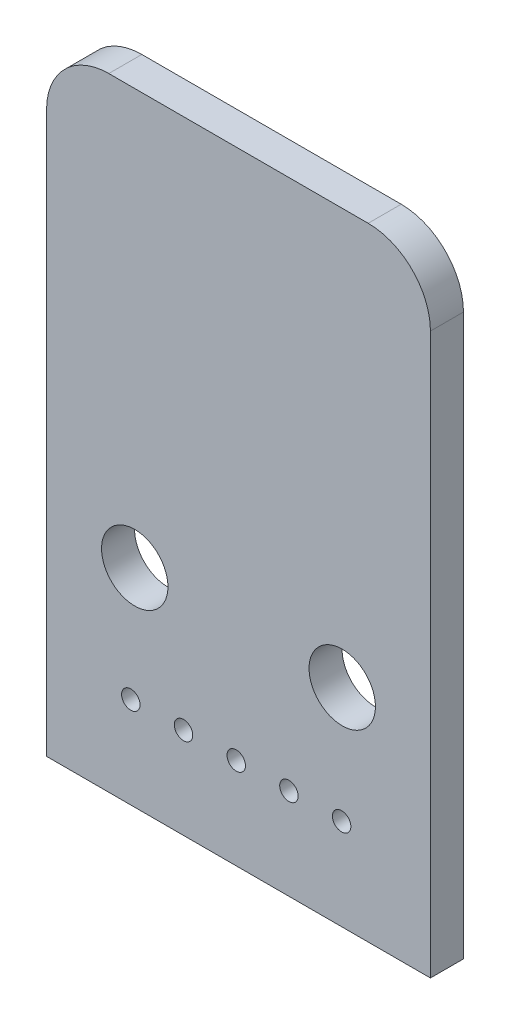
ISO-10303-21;
HEADER;
FILE_DESCRIPTION(('STEP AP214'),'2;1');
FILE_NAME('part.step','',(''),(''),'','','');
FILE_SCHEMA(('AUTOMOTIVE_DESIGN { 1 0 10303 214 1 1 1 1 }'));
ENDSEC;
DATA;
#1=APPLICATION_CONTEXT('core data for automotive mechanical design processes');
#2=APPLICATION_PROTOCOL_DEFINITION('international standard','automotive_design',2000,#1);
#3=PRODUCT_CONTEXT('',#1,'mechanical');
#4=PRODUCT('Part','Part','',(#3));
#5=PRODUCT_RELATED_PRODUCT_CATEGORY('part','',(#4));
#6=PRODUCT_DEFINITION_FORMATION('','',#4);
#7=PRODUCT_DEFINITION_CONTEXT('part definition',#1,'design');
#8=PRODUCT_DEFINITION('design','',#6,#7);
#9=PRODUCT_DEFINITION_SHAPE('','',#8);
#10=(LENGTH_UNIT() NAMED_UNIT(*) SI_UNIT(.MILLI.,.METRE.));
#11=(NAMED_UNIT(*) PLANE_ANGLE_UNIT() SI_UNIT($,.RADIAN.));
#12=(NAMED_UNIT(*) SI_UNIT($,.STERADIAN.) SOLID_ANGLE_UNIT());
#13=UNCERTAINTY_MEASURE_WITH_UNIT(LENGTH_MEASURE(1.E-05),#10,'distance_accuracy_value','');
#14=(GEOMETRIC_REPRESENTATION_CONTEXT(3) GLOBAL_UNCERTAINTY_ASSIGNED_CONTEXT((#13)) GLOBAL_UNIT_ASSIGNED_CONTEXT((#10,
#11,#12)) REPRESENTATION_CONTEXT('',''));
#15=CARTESIAN_POINT('',(0.,0.,0.));
#16=DIRECTION('',(0.,0.,1.));
#17=DIRECTION('',(1.,0.,0.));
#18=AXIS2_PLACEMENT_3D('',#15,#16,#17);
#19=CARTESIAN_POINT('',(156.54899597168,41.930000305176,1.59143954));
#20=DIRECTION('',(0.,0.,1.));
#21=DIRECTION('',(1.,0.,0.));
#22=AXIS2_PLACEMENT_3D('',#19,#20,#21);
#23=PLANE('',#22);
#24=CARTESIAN_POINT('',(170.79900054,51.93000028,1.59143954));
#25=DIRECTION('',(0.,0.,1.));
#26=DIRECTION('',(1.,0.,0.));
#27=AXIS2_PLACEMENT_3D('',#24,#25,#26);
#28=CIRCLE('',#27,1.59999934);
#29=CARTESIAN_POINT('',(172.39899988,51.93000028,1.59143954));
#30=VERTEX_POINT('',#29);
#31=EDGE_CURVE('E27',#30,#30,#28,.T.);
#32=ORIENTED_EDGE('',*,*,#31,.F.);
#33=EDGE_LOOP('',(#32));
#34=FACE_BOUND('',#33,.T.);
#35=CARTESIAN_POINT('',(170.76999882,46.32999878,1.59143954));
#36=DIRECTION('',(0.,0.,1.));
#37=DIRECTION('',(1.,0.,0.));
#38=AXIS2_PLACEMENT_3D('',#35,#36,#37);
#39=CIRCLE('',#38,0.4445);
#40=CARTESIAN_POINT('',(171.21449882,46.32999878,1.59143954));
#41=VERTEX_POINT('',#40);
#42=EDGE_CURVE('E158',#41,#41,#39,.T.);
#43=ORIENTED_EDGE('',*,*,#42,.F.);
#44=EDGE_LOOP('',(#43));
#45=FACE_BOUND('',#44,.T.);
#46=CARTESIAN_POINT('',(168.22999882,46.32999878,1.59143954));
#47=DIRECTION('',(0.,0.,1.));
#48=DIRECTION('',(1.,0.,0.));
#49=AXIS2_PLACEMENT_3D('',#46,#47,#48);
#50=CIRCLE('',#49,0.4445);
#51=CARTESIAN_POINT('',(168.67449882,46.32999878,1.59143954));
#52=VERTEX_POINT('',#51);
#53=EDGE_CURVE('E150',#52,#52,#50,.T.);
#54=ORIENTED_EDGE('',*,*,#53,.F.);
#55=EDGE_LOOP('',(#54));
#56=FACE_BOUND('',#55,.T.);
#57=CARTESIAN_POINT('',(165.68999882,46.32999878,1.59143954));
#58=DIRECTION('',(0.,0.,1.));
#59=DIRECTION('',(1.,0.,0.));
#60=AXIS2_PLACEMENT_3D('',#57,#58,#59);
#61=CIRCLE('',#60,0.4445);
#62=CARTESIAN_POINT('',(166.13449882,46.32999878,1.59143954));
#63=VERTEX_POINT('',#62);
#64=EDGE_CURVE('E241',#63,#63,#61,.T.);
#65=ORIENTED_EDGE('',*,*,#64,.F.);
#66=EDGE_LOOP('',(#65));
#67=FACE_BOUND('',#66,.T.);
#68=CARTESIAN_POINT('',(160.79900022,51.93000028,1.59143954));
#69=DIRECTION('',(0.,0.,1.));
#70=DIRECTION('',(1.,0.,0.));
#71=AXIS2_PLACEMENT_3D('',#68,#69,#70);
#72=CIRCLE('',#71,1.59999934);
#73=CARTESIAN_POINT('',(162.39899956,51.93000028,1.59143954));
#74=VERTEX_POINT('',#73);
#75=EDGE_CURVE('E177',#74,#74,#72,.T.);
#76=ORIENTED_EDGE('',*,*,#75,.F.);
#77=EDGE_LOOP('',(#76));
#78=FACE_BOUND('',#77,.T.);
#79=CARTESIAN_POINT('',(160.60999882,46.32999878,1.59143954));
#80=DIRECTION('',(0.,0.,1.));
#81=DIRECTION('',(1.,0.,0.));
#82=AXIS2_PLACEMENT_3D('',#79,#80,#81);
#83=CIRCLE('',#82,0.4445);
#84=CARTESIAN_POINT('',(161.05449882,46.32999878,1.59143954));
#85=VERTEX_POINT('',#84);
#86=EDGE_CURVE('E208',#85,#85,#83,.T.);
#87=ORIENTED_EDGE('',*,*,#86,.F.);
#88=EDGE_LOOP('',(#87));
#89=FACE_BOUND('',#88,.T.);
#90=CARTESIAN_POINT('',(163.14999882,46.32999878,1.59143954));
#91=DIRECTION('',(0.,0.,1.));
#92=DIRECTION('',(1.,0.,0.));
#93=AXIS2_PLACEMENT_3D('',#90,#91,#92);
#94=CIRCLE('',#93,0.4445);
#95=CARTESIAN_POINT('',(163.59449882,46.32999878,1.59143954));
#96=VERTEX_POINT('',#95);
#97=EDGE_CURVE('E185',#96,#96,#94,.T.);
#98=ORIENTED_EDGE('',*,*,#97,.F.);
#99=EDGE_LOOP('',(#98));
#100=FACE_BOUND('',#99,.T.);
#101=DIRECTION('',(-1.,0.,0.));
#102=VECTOR('',#101,1.);
#103=CARTESIAN_POINT('',(175.04899597168,41.930000305176,1.59143954));
#104=LINE('',#103,#102);
#105=CARTESIAN_POINT('',(175.04899597168,41.930000305176,1.59143954));
#106=VERTEX_POINT('',#105);
#107=CARTESIAN_POINT('',(156.54899597168,41.930000305176,1.59143954));
#108=VERTEX_POINT('',#107);
#109=EDGE_CURVE('E199',#106,#108,#104,.T.);
#110=ORIENTED_EDGE('',*,*,#109,.F.);
#111=DIRECTION('',(0.,-1.,0.));
#112=VECTOR('',#111,1.);
#113=CARTESIAN_POINT('',(175.04899597168,68.930000305176,1.59143954));
#114=LINE('',#113,#112);
#115=CARTESIAN_POINT('',(175.04899597168,68.930000305176,1.59143954));
#116=VERTEX_POINT('',#115);
#117=EDGE_CURVE('E167',#116,#106,#114,.T.);
#118=ORIENTED_EDGE('',*,*,#117,.F.);
#119=CARTESIAN_POINT('',(172.0479092773,68.928913610797,1.59143954));
#120=DIRECTION('',(0.,0.,-1.));
#121=DIRECTION('',(0.00036210027185109,0.999999934441694,0.));
#122=AXIS2_PLACEMENT_3D('',#119,#120,#121);
#123=CIRCLE('',#122,3.001086891125);
#124=CARTESIAN_POINT('',(172.04899597168,71.930000305176,1.59143954));
#125=VERTEX_POINT('',#124);
#126=EDGE_CURVE('E226',#125,#116,#123,.T.);
#127=ORIENTED_EDGE('',*,*,#126,.F.);
#128=DIRECTION('',(1.,0.,0.));
#129=VECTOR('',#128,1.);
#130=CARTESIAN_POINT('',(159.54899597168,71.930000305176,1.59143954));
#131=LINE('',#130,#129);
#132=CARTESIAN_POINT('',(159.54899597168,71.930000305176,1.59143954));
#133=VERTEX_POINT('',#132);
#134=EDGE_CURVE('E175',#133,#125,#131,.T.);
#135=ORIENTED_EDGE('',*,*,#134,.F.);
#136=CARTESIAN_POINT('',(159.55008266605,68.928913610797,1.59143954));
#137=DIRECTION('',(0.,0.,-1.));
#138=DIRECTION('',(-0.999999934441694,0.00036210027185109,0.));
#139=AXIS2_PLACEMENT_3D('',#136,#137,#138);
#140=CIRCLE('',#139,3.001086891125);
#141=CARTESIAN_POINT('',(156.54899597168,68.930000305176,1.59143954));
#142=VERTEX_POINT('',#141);
#143=EDGE_CURVE('E212',#142,#133,#140,.T.);
#144=ORIENTED_EDGE('',*,*,#143,.F.);
#145=DIRECTION('',(0.,1.,0.));
#146=VECTOR('',#145,1.);
#147=CARTESIAN_POINT('',(156.54899597168,41.930000305176,1.59143954));
#148=LINE('',#147,#146);
#149=EDGE_CURVE('E204',#108,#142,#148,.T.);
#150=ORIENTED_EDGE('',*,*,#149,.F.);
#151=EDGE_LOOP('',(#110,#118,#127,#135,#144,#150));
#152=FACE_BOUND('',#151,.T.);
#153=ADVANCED_FACE('F16',(#34,#45,#56,#67,#78,#89,#100,#152),#23,.T.);
#154=CARTESIAN_POINT('',(156.54899597168,41.930000305176,0.));
#155=DIRECTION('',(0.,0.,1.));
#156=DIRECTION('',(1.,0.,0.));
#157=AXIS2_PLACEMENT_3D('',#154,#155,#156);
#158=PLANE('',#157);
#159=CARTESIAN_POINT('',(170.79900054,51.93000028,0.));
#160=DIRECTION('',(0.,0.,1.));
#161=DIRECTION('',(1.,0.,0.));
#162=AXIS2_PLACEMENT_3D('',#159,#160,#161);
#163=CIRCLE('',#162,1.59999934);
#164=CARTESIAN_POINT('',(172.39899988,51.93000028,0.));
#165=VERTEX_POINT('',#164);
#166=EDGE_CURVE('E11',#165,#165,#163,.T.);
#167=ORIENTED_EDGE('',*,*,#166,.T.);
#168=EDGE_LOOP('',(#167));
#169=FACE_BOUND('',#168,.T.);
#170=CARTESIAN_POINT('',(170.76999882,46.32999878,0.));
#171=DIRECTION('',(0.,0.,1.));
#172=DIRECTION('',(1.,0.,0.));
#173=AXIS2_PLACEMENT_3D('',#170,#171,#172);
#174=CIRCLE('',#173,0.4445);
#175=CARTESIAN_POINT('',(171.21449882,46.32999878,0.));
#176=VERTEX_POINT('',#175);
#177=EDGE_CURVE('E188',#176,#176,#174,.T.);
#178=ORIENTED_EDGE('',*,*,#177,.T.);
#179=EDGE_LOOP('',(#178));
#180=FACE_BOUND('',#179,.T.);
#181=CARTESIAN_POINT('',(168.22999882,46.32999878,0.));
#182=DIRECTION('',(0.,0.,1.));
#183=DIRECTION('',(1.,0.,0.));
#184=AXIS2_PLACEMENT_3D('',#181,#182,#183);
#185=CIRCLE('',#184,0.4445);
#186=CARTESIAN_POINT('',(168.67449882,46.32999878,0.));
#187=VERTEX_POINT('',#186);
#188=EDGE_CURVE('E143',#187,#187,#185,.T.);
#189=ORIENTED_EDGE('',*,*,#188,.T.);
#190=EDGE_LOOP('',(#189));
#191=FACE_BOUND('',#190,.T.);
#192=CARTESIAN_POINT('',(165.68999882,46.32999878,0.));
#193=DIRECTION('',(0.,0.,1.));
#194=DIRECTION('',(1.,0.,0.));
#195=AXIS2_PLACEMENT_3D('',#192,#193,#194);
#196=CIRCLE('',#195,0.4445);
#197=CARTESIAN_POINT('',(166.13449882,46.32999878,0.));
#198=VERTEX_POINT('',#197);
#199=EDGE_CURVE('E170',#198,#198,#196,.T.);
#200=ORIENTED_EDGE('',*,*,#199,.T.);
#201=EDGE_LOOP('',(#200));
#202=FACE_BOUND('',#201,.T.);
#203=CARTESIAN_POINT('',(160.79900022,51.93000028,0.));
#204=DIRECTION('',(0.,0.,1.));
#205=DIRECTION('',(1.,0.,0.));
#206=AXIS2_PLACEMENT_3D('',#203,#204,#205);
#207=CIRCLE('',#206,1.59999934);
#208=CARTESIAN_POINT('',(162.39899956,51.93000028,0.));
#209=VERTEX_POINT('',#208);
#210=EDGE_CURVE('E180',#209,#209,#207,.T.);
#211=ORIENTED_EDGE('',*,*,#210,.T.);
#212=EDGE_LOOP('',(#211));
#213=FACE_BOUND('',#212,.T.);
#214=CARTESIAN_POINT('',(160.60999882,46.32999878,0.));
#215=DIRECTION('',(0.,0.,1.));
#216=DIRECTION('',(1.,0.,0.));
#217=AXIS2_PLACEMENT_3D('',#214,#215,#216);
#218=CIRCLE('',#217,0.4445);
#219=CARTESIAN_POINT('',(161.05449882,46.32999878,0.));
#220=VERTEX_POINT('',#219);
#221=EDGE_CURVE('E205',#220,#220,#218,.T.);
#222=ORIENTED_EDGE('',*,*,#221,.T.);
#223=EDGE_LOOP('',(#222));
#224=FACE_BOUND('',#223,.T.);
#225=CARTESIAN_POINT('',(163.14999882,46.32999878,0.));
#226=DIRECTION('',(0.,0.,1.));
#227=DIRECTION('',(1.,0.,0.));
#228=AXIS2_PLACEMENT_3D('',#225,#226,#227);
#229=CIRCLE('',#228,0.4445);
#230=CARTESIAN_POINT('',(163.59449882,46.32999878,0.));
#231=VERTEX_POINT('',#230);
#232=EDGE_CURVE('E90',#231,#231,#229,.T.);
#233=ORIENTED_EDGE('',*,*,#232,.T.);
#234=EDGE_LOOP('',(#233));
#235=FACE_BOUND('',#234,.T.);
#236=DIRECTION('',(0.,1.,0.));
#237=VECTOR('',#236,1.);
#238=CARTESIAN_POINT('',(156.54899597168,41.930000305176,0.));
#239=LINE('',#238,#237);
#240=CARTESIAN_POINT('',(156.54899597168,41.930000305176,0.));
#241=VERTEX_POINT('',#240);
#242=CARTESIAN_POINT('',(156.54899597168,68.930000305176,0.));
#243=VERTEX_POINT('',#242);
#244=EDGE_CURVE('E20',#241,#243,#239,.T.);
#245=ORIENTED_EDGE('',*,*,#244,.T.);
#246=CARTESIAN_POINT('',(159.55008266605,68.928913610797,0.));
#247=DIRECTION('',(0.,0.,-1.));
#248=DIRECTION('',(-0.999999934441694,0.00036210027185109,0.));
#249=AXIS2_PLACEMENT_3D('',#246,#247,#248);
#250=CIRCLE('',#249,3.001086891125);
#251=CARTESIAN_POINT('',(159.54899597168,71.930000305176,0.));
#252=VERTEX_POINT('',#251);
#253=EDGE_CURVE('E171',#243,#252,#250,.T.);
#254=ORIENTED_EDGE('',*,*,#253,.T.);
#255=DIRECTION('',(1.,0.,0.));
#256=VECTOR('',#255,1.);
#257=CARTESIAN_POINT('',(159.54899597168,71.930000305176,0.));
#258=LINE('',#257,#256);
#259=CARTESIAN_POINT('',(172.04899597168,71.930000305176,0.));
#260=VERTEX_POINT('',#259);
#261=EDGE_CURVE('E262',#252,#260,#258,.T.);
#262=ORIENTED_EDGE('',*,*,#261,.T.);
#263=CARTESIAN_POINT('',(172.0479092773,68.928913610797,0.));
#264=DIRECTION('',(0.,0.,-1.));
#265=DIRECTION('',(0.00036210027185109,0.999999934441694,0.));
#266=AXIS2_PLACEMENT_3D('',#263,#264,#265);
#267=CIRCLE('',#266,3.001086891125);
#268=CARTESIAN_POINT('',(175.04899597168,68.930000305176,0.));
#269=VERTEX_POINT('',#268);
#270=EDGE_CURVE('E192',#260,#269,#267,.T.);
#271=ORIENTED_EDGE('',*,*,#270,.T.);
#272=DIRECTION('',(0.,-1.,0.));
#273=VECTOR('',#272,1.);
#274=CARTESIAN_POINT('',(175.04899597168,68.930000305176,0.));
#275=LINE('',#274,#273);
#276=CARTESIAN_POINT('',(175.04899597168,41.930000305176,0.));
#277=VERTEX_POINT('',#276);
#278=EDGE_CURVE('E166',#269,#277,#275,.T.);
#279=ORIENTED_EDGE('',*,*,#278,.T.);
#280=DIRECTION('',(-1.,0.,0.));
#281=VECTOR('',#280,1.);
#282=CARTESIAN_POINT('',(175.04899597168,41.930000305176,0.));
#283=LINE('',#282,#281);
#284=EDGE_CURVE('E105',#277,#241,#283,.T.);
#285=ORIENTED_EDGE('',*,*,#284,.T.);
#286=EDGE_LOOP('',(#245,#254,#262,#271,#279,#285));
#287=FACE_BOUND('',#286,.T.);
#288=ADVANCED_FACE('F18',(#169,#180,#191,#202,#213,#224,#235,#287),#158,.F.);
#289=CARTESIAN_POINT('',(170.79900054,51.93000028,0.));
#290=DIRECTION('',(0.,0.,-1.));
#291=DIRECTION('',(1.,0.,0.));
#292=AXIS2_PLACEMENT_3D('',#289,#290,#291);
#293=CYLINDRICAL_SURFACE('',#292,1.59999934);
#294=DIRECTION('',(0.,0.,1.));
#295=VECTOR('',#294,1.);
#296=CARTESIAN_POINT('',(172.39899988,51.93000028,0.));
#297=LINE('',#296,#295);
#298=EDGE_CURVE('E219',#165,#30,#297,.T.);
#299=ORIENTED_EDGE('',*,*,#298,.T.);
#300=ORIENTED_EDGE('',*,*,#31,.T.);
#301=ORIENTED_EDGE('',*,*,#298,.F.);
#302=ORIENTED_EDGE('',*,*,#166,.F.);
#303=EDGE_LOOP('',(#299,#300,#301,#302));
#304=FACE_BOUND('',#303,.T.);
#305=ADVANCED_FACE('F319',(#304),#293,.F.);
#306=CARTESIAN_POINT('',(170.76999882,46.32999878,0.));
#307=DIRECTION('',(0.,0.,-1.));
#308=DIRECTION('',(1.,0.,0.));
#309=AXIS2_PLACEMENT_3D('',#306,#307,#308);
#310=CYLINDRICAL_SURFACE('',#309,0.4445);
#311=DIRECTION('',(0.,0.,1.));
#312=VECTOR('',#311,1.);
#313=CARTESIAN_POINT('',(171.21449882,46.32999878,0.));
#314=LINE('',#313,#312);
#315=EDGE_CURVE('E149',#176,#41,#314,.T.);
#316=ORIENTED_EDGE('',*,*,#315,.T.);
#317=ORIENTED_EDGE('',*,*,#42,.T.);
#318=ORIENTED_EDGE('',*,*,#315,.F.);
#319=ORIENTED_EDGE('',*,*,#177,.F.);
#320=EDGE_LOOP('',(#316,#317,#318,#319));
#321=FACE_BOUND('',#320,.T.);
#322=ADVANCED_FACE('F358',(#321),#310,.F.);
#323=CARTESIAN_POINT('',(168.22999882,46.32999878,0.));
#324=DIRECTION('',(0.,0.,-1.));
#325=DIRECTION('',(1.,0.,0.));
#326=AXIS2_PLACEMENT_3D('',#323,#324,#325);
#327=CYLINDRICAL_SURFACE('',#326,0.4445);
#328=DIRECTION('',(0.,0.,1.));
#329=VECTOR('',#328,1.);
#330=CARTESIAN_POINT('',(168.67449882,46.32999878,0.));
#331=LINE('',#330,#329);
#332=EDGE_CURVE('E160',#187,#52,#331,.T.);
#333=ORIENTED_EDGE('',*,*,#332,.T.);
#334=ORIENTED_EDGE('',*,*,#53,.T.);
#335=ORIENTED_EDGE('',*,*,#332,.F.);
#336=ORIENTED_EDGE('',*,*,#188,.F.);
#337=EDGE_LOOP('',(#333,#334,#335,#336));
#338=FACE_BOUND('',#337,.T.);
#339=ADVANCED_FACE('F353',(#338),#327,.F.);
#340=CARTESIAN_POINT('',(165.68999882,46.32999878,0.));
#341=DIRECTION('',(0.,0.,-1.));
#342=DIRECTION('',(1.,0.,0.));
#343=AXIS2_PLACEMENT_3D('',#340,#341,#342);
#344=CYLINDRICAL_SURFACE('',#343,0.4445);
#345=DIRECTION('',(0.,0.,1.));
#346=VECTOR('',#345,1.);
#347=CARTESIAN_POINT('',(166.13449882,46.32999878,0.));
#348=LINE('',#347,#346);
#349=EDGE_CURVE('E195',#198,#63,#348,.T.);
#350=ORIENTED_EDGE('',*,*,#349,.T.);
#351=ORIENTED_EDGE('',*,*,#64,.T.);
#352=ORIENTED_EDGE('',*,*,#349,.F.);
#353=ORIENTED_EDGE('',*,*,#199,.F.);
#354=EDGE_LOOP('',(#350,#351,#352,#353));
#355=FACE_BOUND('',#354,.T.);
#356=ADVANCED_FACE('F338',(#355),#344,.F.);
#357=CARTESIAN_POINT('',(160.79900022,51.93000028,0.));
#358=DIRECTION('',(0.,0.,-1.));
#359=DIRECTION('',(1.,0.,0.));
#360=AXIS2_PLACEMENT_3D('',#357,#358,#359);
#361=CYLINDRICAL_SURFACE('',#360,1.59999934);
#362=DIRECTION('',(0.,0.,1.));
#363=VECTOR('',#362,1.);
#364=CARTESIAN_POINT('',(162.39899956,51.93000028,0.));
#365=LINE('',#364,#363);
#366=EDGE_CURVE('E181',#209,#74,#365,.T.);
#367=ORIENTED_EDGE('',*,*,#366,.T.);
#368=ORIENTED_EDGE('',*,*,#75,.T.);
#369=ORIENTED_EDGE('',*,*,#366,.F.);
#370=ORIENTED_EDGE('',*,*,#210,.F.);
#371=EDGE_LOOP('',(#367,#368,#369,#370));
#372=FACE_BOUND('',#371,.T.);
#373=ADVANCED_FACE('F333',(#372),#361,.F.);
#374=CARTESIAN_POINT('',(160.60999882,46.32999878,0.));
#375=DIRECTION('',(0.,0.,-1.));
#376=DIRECTION('',(1.,0.,0.));
#377=AXIS2_PLACEMENT_3D('',#374,#375,#376);
#378=CYLINDRICAL_SURFACE('',#377,0.4445);
#379=DIRECTION('',(0.,0.,1.));
#380=VECTOR('',#379,1.);
#381=CARTESIAN_POINT('',(161.05449882,46.32999878,0.));
#382=LINE('',#381,#380);
#383=EDGE_CURVE('E184',#220,#85,#382,.T.);
#384=ORIENTED_EDGE('',*,*,#383,.T.);
#385=ORIENTED_EDGE('',*,*,#86,.T.);
#386=ORIENTED_EDGE('',*,*,#383,.F.);
#387=ORIENTED_EDGE('',*,*,#221,.F.);
#388=EDGE_LOOP('',(#384,#385,#386,#387));
#389=FACE_BOUND('',#388,.T.);
#390=ADVANCED_FACE('F279',(#389),#378,.F.);
#391=CARTESIAN_POINT('',(163.14999882,46.32999878,0.));
#392=DIRECTION('',(0.,0.,-1.));
#393=DIRECTION('',(1.,0.,0.));
#394=AXIS2_PLACEMENT_3D('',#391,#392,#393);
#395=CYLINDRICAL_SURFACE('',#394,0.4445);
#396=DIRECTION('',(0.,0.,1.));
#397=VECTOR('',#396,1.);
#398=CARTESIAN_POINT('',(163.59449882,46.32999878,0.));
#399=LINE('',#398,#397);
#400=EDGE_CURVE('E198',#231,#96,#399,.T.);
#401=ORIENTED_EDGE('',*,*,#400,.T.);
#402=ORIENTED_EDGE('',*,*,#97,.T.);
#403=ORIENTED_EDGE('',*,*,#400,.F.);
#404=ORIENTED_EDGE('',*,*,#232,.F.);
#405=EDGE_LOOP('',(#401,#402,#403,#404));
#406=FACE_BOUND('',#405,.T.);
#407=ADVANCED_FACE('F348',(#406),#395,.F.);
#408=CARTESIAN_POINT('',(175.04899597168,41.930000305176,0.));
#409=DIRECTION('',(0.,-1.,0.));
#410=DIRECTION('',(0.,0.,-1.));
#411=AXIS2_PLACEMENT_3D('',#408,#409,#410);
#412=PLANE('',#411);
#413=DIRECTION('',(0.,0.,1.));
#414=VECTOR('',#413,1.);
#415=CARTESIAN_POINT('',(175.04899597168,41.930000305176,0.));
#416=LINE('',#415,#414);
#417=EDGE_CURVE('E163',#277,#106,#416,.T.);
#418=ORIENTED_EDGE('',*,*,#417,.T.);
#419=ORIENTED_EDGE('',*,*,#109,.T.);
#420=DIRECTION('',(0.,0.,1.));
#421=VECTOR('',#420,1.);
#422=CARTESIAN_POINT('',(156.54899597168,41.930000305176,0.));
#423=LINE('',#422,#421);
#424=EDGE_CURVE('E200',#241,#108,#423,.T.);
#425=ORIENTED_EDGE('',*,*,#424,.F.);
#426=ORIENTED_EDGE('',*,*,#284,.F.);
#427=EDGE_LOOP('',(#418,#419,#425,#426));
#428=FACE_BOUND('',#427,.T.);
#429=ADVANCED_FACE('F291',(#428),#412,.T.);
#430=CARTESIAN_POINT('',(175.04899597168,68.930000305176,0.));
#431=DIRECTION('',(1.,0.,0.));
#432=DIRECTION('',(0.,1.,0.));
#433=AXIS2_PLACEMENT_3D('',#430,#431,#432);
#434=PLANE('',#433);
#435=DIRECTION('',(0.,0.,1.));
#436=VECTOR('',#435,1.);
#437=CARTESIAN_POINT('',(175.04899597168,68.930000305176,0.));
#438=LINE('',#437,#436);
#439=EDGE_CURVE('E222',#269,#116,#438,.T.);
#440=ORIENTED_EDGE('',*,*,#439,.T.);
#441=ORIENTED_EDGE('',*,*,#117,.T.);
#442=ORIENTED_EDGE('',*,*,#417,.F.);
#443=ORIENTED_EDGE('',*,*,#278,.F.);
#444=EDGE_LOOP('',(#440,#441,#442,#443));
#445=FACE_BOUND('',#444,.T.);
#446=ADVANCED_FACE('F293',(#445),#434,.T.);
#447=CARTESIAN_POINT('',(172.0479092773,68.928913610797,0.));
#448=DIRECTION('',(0.,0.,-1.));
#449=DIRECTION('',(0.00036210027185109,0.999999934441694,0.));
#450=AXIS2_PLACEMENT_3D('',#447,#448,#449);
#451=CYLINDRICAL_SURFACE('',#450,3.001086891125);
#452=DIRECTION('',(0.,0.,1.));
#453=VECTOR('',#452,1.);
#454=CARTESIAN_POINT('',(172.04899597168,71.930000305176,0.));
#455=LINE('',#454,#453);
#456=EDGE_CURVE('E216',#260,#125,#455,.T.);
#457=ORIENTED_EDGE('',*,*,#456,.T.);
#458=ORIENTED_EDGE('',*,*,#126,.T.);
#459=ORIENTED_EDGE('',*,*,#439,.F.);
#460=ORIENTED_EDGE('',*,*,#270,.F.);
#461=EDGE_LOOP('',(#457,#458,#459,#460));
#462=FACE_BOUND('',#461,.T.);
#463=ADVANCED_FACE('F296',(#462),#451,.T.);
#464=CARTESIAN_POINT('',(159.54899597168,71.930000305176,0.));
#465=DIRECTION('',(0.,1.,0.));
#466=DIRECTION('',(1.,0.,0.));
#467=AXIS2_PLACEMENT_3D('',#464,#465,#466);
#468=PLANE('',#467);
#469=DIRECTION('',(0.,0.,1.));
#470=VECTOR('',#469,1.);
#471=CARTESIAN_POINT('',(159.54899597168,71.930000305176,0.));
#472=LINE('',#471,#470);
#473=EDGE_CURVE('E176',#252,#133,#472,.T.);
#474=ORIENTED_EDGE('',*,*,#473,.T.);
#475=ORIENTED_EDGE('',*,*,#134,.T.);
#476=ORIENTED_EDGE('',*,*,#456,.F.);
#477=ORIENTED_EDGE('',*,*,#261,.F.);
#478=EDGE_LOOP('',(#474,#475,#476,#477));
#479=FACE_BOUND('',#478,.T.);
#480=ADVANCED_FACE('F300',(#479),#468,.T.);
#481=CARTESIAN_POINT('',(159.55008266605,68.928913610797,0.));
#482=DIRECTION('',(0.,0.,-1.));
#483=DIRECTION('',(-0.999999934441694,0.00036210027185109,0.));
#484=AXIS2_PLACEMENT_3D('',#481,#482,#483);
#485=CYLINDRICAL_SURFACE('',#484,3.001086891125);
#486=DIRECTION('',(0.,0.,1.));
#487=VECTOR('',#486,1.);
#488=CARTESIAN_POINT('',(156.54899597168,68.930000305176,0.));
#489=LINE('',#488,#487);
#490=EDGE_CURVE('E242',#243,#142,#489,.T.);
#491=ORIENTED_EDGE('',*,*,#490,.T.);
#492=ORIENTED_EDGE('',*,*,#143,.T.);
#493=ORIENTED_EDGE('',*,*,#473,.F.);
#494=ORIENTED_EDGE('',*,*,#253,.F.);
#495=EDGE_LOOP('',(#491,#492,#493,#494));
#496=FACE_BOUND('',#495,.T.);
#497=ADVANCED_FACE('F303',(#496),#485,.T.);
#498=CARTESIAN_POINT('',(156.54899597168,41.930000305176,0.));
#499=DIRECTION('',(-1.,0.,0.));
#500=DIRECTION('',(0.,0.,1.));
#501=AXIS2_PLACEMENT_3D('',#498,#499,#500);
#502=PLANE('',#501);
#503=ORIENTED_EDGE('',*,*,#424,.T.);
#504=ORIENTED_EDGE('',*,*,#149,.T.);
#505=ORIENTED_EDGE('',*,*,#490,.F.);
#506=ORIENTED_EDGE('',*,*,#244,.F.);
#507=EDGE_LOOP('',(#503,#504,#505,#506));
#508=FACE_BOUND('',#507,.T.);
#509=ADVANCED_FACE('F308',(#508),#502,.T.);
#510=CLOSED_SHELL('',(#153,#288,#305,#322,#339,#356,#373,#390,#407,#429,#446,#463,#480,#497,#509));
#511=MANIFOLD_SOLID_BREP('B1',#510);
#512=ADVANCED_BREP_SHAPE_REPRESENTATION('',(#18,#511),#14);
#513=SHAPE_DEFINITION_REPRESENTATION(#9,#512);
ENDSEC;
END-ISO-10303-21;
